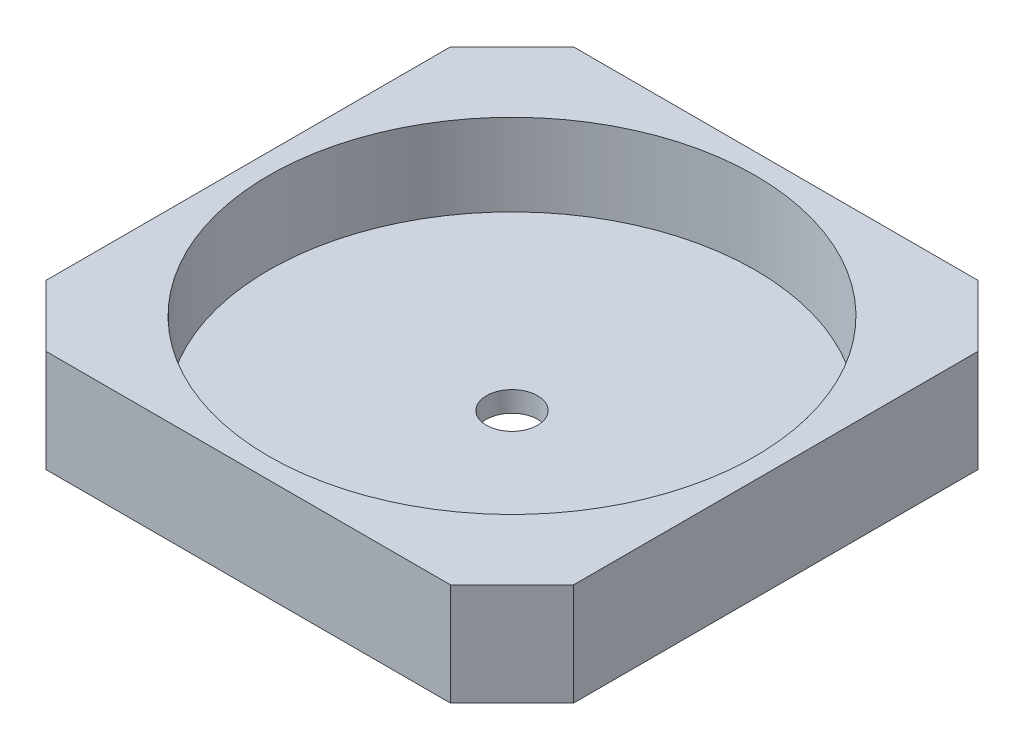
ISO-10303-21;
HEADER;
FILE_DESCRIPTION(('STEP AP214'),'2;1');
FILE_NAME('part.step','',(''),(''),'','','');
FILE_SCHEMA(('AUTOMOTIVE_DESIGN { 1 0 10303 214 1 1 1 1 }'));
ENDSEC;
DATA;
#1=APPLICATION_CONTEXT('core data for automotive mechanical design processes');
#2=APPLICATION_PROTOCOL_DEFINITION('international standard','automotive_design',2000,#1);
#3=PRODUCT_CONTEXT('',#1,'mechanical');
#4=PRODUCT('Part','Part','',(#3));
#5=PRODUCT_RELATED_PRODUCT_CATEGORY('part','',(#4));
#6=PRODUCT_DEFINITION_FORMATION('','',#4);
#7=PRODUCT_DEFINITION_CONTEXT('part definition',#1,'design');
#8=PRODUCT_DEFINITION('design','',#6,#7);
#9=PRODUCT_DEFINITION_SHAPE('','',#8);
#10=(LENGTH_UNIT() NAMED_UNIT(*) SI_UNIT(.MILLI.,.METRE.));
#11=(NAMED_UNIT(*) PLANE_ANGLE_UNIT() SI_UNIT($,.RADIAN.));
#12=(NAMED_UNIT(*) SI_UNIT($,.STERADIAN.) SOLID_ANGLE_UNIT());
#13=UNCERTAINTY_MEASURE_WITH_UNIT(LENGTH_MEASURE(1.E-05),#10,'distance_accuracy_value','');
#14=(GEOMETRIC_REPRESENTATION_CONTEXT(3) GLOBAL_UNCERTAINTY_ASSIGNED_CONTEXT((#13)) GLOBAL_UNIT_ASSIGNED_CONTEXT((#10,
#11,#12)) REPRESENTATION_CONTEXT('',''));
#15=CARTESIAN_POINT('',(0.,0.,0.));
#16=DIRECTION('',(0.,0.,1.));
#17=DIRECTION('',(1.,0.,0.));
#18=AXIS2_PLACEMENT_3D('',#15,#16,#17);
#19=CARTESIAN_POINT('',(0.,50.,0.));
#20=DIRECTION('',(0.,-1.,0.));
#21=DIRECTION('',(0.,0.,-1.));
#22=AXIS2_PLACEMENT_3D('',#19,#20,#21);
#23=CYLINDRICAL_SURFACE('',#22,118.75);
#24=CARTESIAN_POINT('',(0.,50.,0.));
#25=DIRECTION('',(0.,1.,0.));
#26=DIRECTION('',(0.,0.,1.));
#27=AXIS2_PLACEMENT_3D('',#24,#25,#26);
#28=CIRCLE('',#27,118.75);
#29=CARTESIAN_POINT('',(0.,50.,118.75));
#30=VERTEX_POINT('',#29);
#31=EDGE_CURVE('E187',#30,#30,#28,.T.);
#32=ORIENTED_EDGE('',*,*,#31,.T.);
#33=EDGE_LOOP('',(#32));
#34=FACE_BOUND('',#33,.T.);
#35=CARTESIAN_POINT('',(0.,10.,0.));
#36=DIRECTION('',(0.,-1.,0.));
#37=DIRECTION('',(0.,0.,-1.));
#38=AXIS2_PLACEMENT_3D('',#35,#36,#37);
#39=CIRCLE('',#38,118.75);
#40=CARTESIAN_POINT('',(0.,10.,-118.75));
#41=VERTEX_POINT('',#40);
#42=EDGE_CURVE('E192',#41,#41,#39,.T.);
#43=ORIENTED_EDGE('',*,*,#42,.T.);
#44=EDGE_LOOP('',(#43));
#45=FACE_BOUND('',#44,.T.);
#46=ADVANCED_FACE('F39',(#34,#45),#23,.F.);
#47=CARTESIAN_POINT('',(113.75,50.,-113.75));
#48=DIRECTION('',(0.707106781186547,0.,-0.707106781186548));
#49=DIRECTION('',(-0.707106781186548,0.,-0.707106781186547));
#50=AXIS2_PLACEMENT_3D('',#47,#48,#49);
#51=PLANE('',#50);
#52=DIRECTION('',(0.707106781186548,0.,0.707106781186547));
#53=VECTOR('',#52,1.);
#54=CARTESIAN_POINT('',(113.75,0.,-113.75));
#55=LINE('',#54,#53);
#56=CARTESIAN_POINT('',(98.75,0.,-128.75));
#57=VERTEX_POINT('',#56);
#58=CARTESIAN_POINT('',(128.75,0.,-98.75));
#59=VERTEX_POINT('',#58);
#60=EDGE_CURVE('E161',#57,#59,#55,.T.);
#61=ORIENTED_EDGE('',*,*,#60,.F.);
#62=DIRECTION('',(0.,-1.,0.));
#63=VECTOR('',#62,1.);
#64=CARTESIAN_POINT('',(98.75,50.,-128.75));
#65=LINE('',#64,#63);
#66=CARTESIAN_POINT('',(98.75,50.,-128.75));
#67=VERTEX_POINT('',#66);
#68=EDGE_CURVE('E11',#67,#57,#65,.T.);
#69=ORIENTED_EDGE('',*,*,#68,.F.);
#70=DIRECTION('',(0.707106781186548,0.,0.707106781186547));
#71=VECTOR('',#70,1.);
#72=CARTESIAN_POINT('',(113.75,50.,-113.75));
#73=LINE('',#72,#71);
#74=CARTESIAN_POINT('',(128.75,50.,-98.75));
#75=VERTEX_POINT('',#74);
#76=EDGE_CURVE('E208',#67,#75,#73,.T.);
#77=ORIENTED_EDGE('',*,*,#76,.T.);
#78=DIRECTION('',(0.,-1.,0.));
#79=VECTOR('',#78,1.);
#80=CARTESIAN_POINT('',(128.75,50.,-98.75));
#81=LINE('',#80,#79);
#82=EDGE_CURVE('E56',#75,#59,#81,.T.);
#83=ORIENTED_EDGE('',*,*,#82,.T.);
#84=EDGE_LOOP('',(#61,#69,#77,#83));
#85=FACE_BOUND('',#84,.T.);
#86=ADVANCED_FACE('F238',(#85),#51,.T.);
#87=CARTESIAN_POINT('',(0.,50.,-128.75));
#88=DIRECTION('',(0.,0.,-1.));
#89=DIRECTION('',(-1.,0.,0.));
#90=AXIS2_PLACEMENT_3D('',#87,#88,#89);
#91=PLANE('',#90);
#92=DIRECTION('',(1.,0.,0.));
#93=VECTOR('',#92,1.);
#94=CARTESIAN_POINT('',(0.,0.,-128.75));
#95=LINE('',#94,#93);
#96=CARTESIAN_POINT('',(-98.75,0.,-128.75));
#97=VERTEX_POINT('',#96);
#98=EDGE_CURVE('E157',#97,#57,#95,.T.);
#99=ORIENTED_EDGE('',*,*,#98,.F.);
#100=DIRECTION('',(0.,-1.,0.));
#101=VECTOR('',#100,1.);
#102=CARTESIAN_POINT('',(-98.75,50.,-128.75));
#103=LINE('',#102,#101);
#104=CARTESIAN_POINT('',(-98.75,50.,-128.75));
#105=VERTEX_POINT('',#104);
#106=EDGE_CURVE('E48',#105,#97,#103,.T.);
#107=ORIENTED_EDGE('',*,*,#106,.F.);
#108=DIRECTION('',(1.,0.,0.));
#109=VECTOR('',#108,1.);
#110=CARTESIAN_POINT('',(0.,50.,-128.75));
#111=LINE('',#110,#109);
#112=EDGE_CURVE('E211',#105,#67,#111,.T.);
#113=ORIENTED_EDGE('',*,*,#112,.T.);
#114=ORIENTED_EDGE('',*,*,#68,.T.);
#115=EDGE_LOOP('',(#99,#107,#113,#114));
#116=FACE_BOUND('',#115,.T.);
#117=ADVANCED_FACE('F158',(#116),#91,.T.);
#118=CARTESIAN_POINT('',(-113.75,50.,-113.75));
#119=DIRECTION('',(-0.707106781186548,0.,-0.707106781186547));
#120=DIRECTION('',(-0.707106781186547,0.,0.707106781186548));
#121=AXIS2_PLACEMENT_3D('',#118,#119,#120);
#122=PLANE('',#121);
#123=DIRECTION('',(0.707106781186547,0.,-0.707106781186548));
#124=VECTOR('',#123,1.);
#125=CARTESIAN_POINT('',(-113.75,0.,-113.75));
#126=LINE('',#125,#124);
#127=CARTESIAN_POINT('',(-128.75,0.,-98.75));
#128=VERTEX_POINT('',#127);
#129=EDGE_CURVE('E150',#128,#97,#126,.T.);
#130=ORIENTED_EDGE('',*,*,#129,.F.);
#131=DIRECTION('',(0.,-1.,0.));
#132=VECTOR('',#131,1.);
#133=CARTESIAN_POINT('',(-128.75,50.,-98.75));
#134=LINE('',#133,#132);
#135=CARTESIAN_POINT('',(-128.75,50.,-98.75));
#136=VERTEX_POINT('',#135);
#137=EDGE_CURVE('E141',#136,#128,#134,.T.);
#138=ORIENTED_EDGE('',*,*,#137,.F.);
#139=DIRECTION('',(0.707106781186547,0.,-0.707106781186548));
#140=VECTOR('',#139,1.);
#141=CARTESIAN_POINT('',(-113.75,50.,-113.75));
#142=LINE('',#141,#140);
#143=EDGE_CURVE('E152',#136,#105,#142,.T.);
#144=ORIENTED_EDGE('',*,*,#143,.T.);
#145=ORIENTED_EDGE('',*,*,#106,.T.);
#146=EDGE_LOOP('',(#130,#138,#144,#145));
#147=FACE_BOUND('',#146,.T.);
#148=ADVANCED_FACE('F148',(#147),#122,.T.);
#149=CARTESIAN_POINT('',(-128.75,50.,0.));
#150=DIRECTION('',(1.,0.,0.));
#151=DIRECTION('',(0.,0.,-1.));
#152=AXIS2_PLACEMENT_3D('',#149,#150,#151);
#153=PLANE('',#152);
#154=DIRECTION('',(0.,0.,1.));
#155=VECTOR('',#154,1.);
#156=CARTESIAN_POINT('',(-128.75,0.,0.));
#157=LINE('',#156,#155);
#158=CARTESIAN_POINT('',(-128.75,0.,98.75));
#159=VERTEX_POINT('',#158);
#160=EDGE_CURVE('E168',#128,#159,#157,.T.);
#161=ORIENTED_EDGE('',*,*,#160,.T.);
#162=DIRECTION('',(0.,-1.,0.));
#163=VECTOR('',#162,1.);
#164=CARTESIAN_POINT('',(-128.75,50.,98.75));
#165=LINE('',#164,#163);
#166=CARTESIAN_POINT('',(-128.75,50.,98.75));
#167=VERTEX_POINT('',#166);
#168=EDGE_CURVE('E134',#167,#159,#165,.T.);
#169=ORIENTED_EDGE('',*,*,#168,.F.);
#170=DIRECTION('',(0.,0.,1.));
#171=VECTOR('',#170,1.);
#172=CARTESIAN_POINT('',(-128.75,50.,0.));
#173=LINE('',#172,#171);
#174=EDGE_CURVE('E216',#136,#167,#173,.T.);
#175=ORIENTED_EDGE('',*,*,#174,.F.);
#176=ORIENTED_EDGE('',*,*,#137,.T.);
#177=EDGE_LOOP('',(#161,#169,#175,#176));
#178=FACE_BOUND('',#177,.T.);
#179=ADVANCED_FACE('F223',(#178),#153,.F.);
#180=CARTESIAN_POINT('',(-113.75,50.,113.75));
#181=DIRECTION('',(0.707106781186548,0.,-0.707106781186547));
#182=DIRECTION('',(-0.707106781186547,0.,-0.707106781186548));
#183=AXIS2_PLACEMENT_3D('',#180,#181,#182);
#184=PLANE('',#183);
#185=DIRECTION('',(0.707106781186547,0.,0.707106781186548));
#186=VECTOR('',#185,1.);
#187=CARTESIAN_POINT('',(-113.75,0.,113.75));
#188=LINE('',#187,#186);
#189=CARTESIAN_POINT('',(-98.75,0.,128.75));
#190=VERTEX_POINT('',#189);
#191=EDGE_CURVE('E172',#159,#190,#188,.T.);
#192=ORIENTED_EDGE('',*,*,#191,.T.);
#193=DIRECTION('',(0.,-1.,0.));
#194=VECTOR('',#193,1.);
#195=CARTESIAN_POINT('',(-98.75,50.,128.75));
#196=LINE('',#195,#194);
#197=CARTESIAN_POINT('',(-98.75,50.,128.75));
#198=VERTEX_POINT('',#197);
#199=EDGE_CURVE('E130',#198,#190,#196,.T.);
#200=ORIENTED_EDGE('',*,*,#199,.F.);
#201=DIRECTION('',(0.707106781186547,0.,0.707106781186548));
#202=VECTOR('',#201,1.);
#203=CARTESIAN_POINT('',(-113.75,50.,113.75));
#204=LINE('',#203,#202);
#205=EDGE_CURVE('E120',#167,#198,#204,.T.);
#206=ORIENTED_EDGE('',*,*,#205,.F.);
#207=ORIENTED_EDGE('',*,*,#168,.T.);
#208=EDGE_LOOP('',(#192,#200,#206,#207));
#209=FACE_BOUND('',#208,.T.);
#210=ADVANCED_FACE('F225',(#209),#184,.F.);
#211=CARTESIAN_POINT('',(0.,50.,128.75));
#212=DIRECTION('',(0.,0.,-1.));
#213=DIRECTION('',(-1.,0.,0.));
#214=AXIS2_PLACEMENT_3D('',#211,#212,#213);
#215=PLANE('',#214);
#216=DIRECTION('',(1.,0.,0.));
#217=VECTOR('',#216,1.);
#218=CARTESIAN_POINT('',(0.,0.,128.75));
#219=LINE('',#218,#217);
#220=CARTESIAN_POINT('',(98.75,0.,128.75));
#221=VERTEX_POINT('',#220);
#222=EDGE_CURVE('E128',#190,#221,#219,.T.);
#223=ORIENTED_EDGE('',*,*,#222,.T.);
#224=DIRECTION('',(0.,-1.,0.));
#225=VECTOR('',#224,1.);
#226=CARTESIAN_POINT('',(98.75,50.,128.75));
#227=LINE('',#226,#225);
#228=CARTESIAN_POINT('',(98.75,50.,128.75));
#229=VERTEX_POINT('',#228);
#230=EDGE_CURVE('E109',#229,#221,#227,.T.);
#231=ORIENTED_EDGE('',*,*,#230,.F.);
#232=DIRECTION('',(1.,0.,0.));
#233=VECTOR('',#232,1.);
#234=CARTESIAN_POINT('',(0.,50.,128.75));
#235=LINE('',#234,#233);
#236=EDGE_CURVE('E115',#198,#229,#235,.T.);
#237=ORIENTED_EDGE('',*,*,#236,.F.);
#238=ORIENTED_EDGE('',*,*,#199,.T.);
#239=EDGE_LOOP('',(#223,#231,#237,#238));
#240=FACE_BOUND('',#239,.T.);
#241=ADVANCED_FACE('F126',(#240),#215,.F.);
#242=CARTESIAN_POINT('',(113.75,50.,113.75));
#243=DIRECTION('',(-0.707106781186548,0.,-0.707106781186548));
#244=DIRECTION('',(-0.707106781186548,0.,0.707106781186548));
#245=AXIS2_PLACEMENT_3D('',#242,#243,#244);
#246=PLANE('',#245);
#247=DIRECTION('',(0.707106781186548,0.,-0.707106781186548));
#248=VECTOR('',#247,1.);
#249=CARTESIAN_POINT('',(113.75,0.,113.75));
#250=LINE('',#249,#248);
#251=CARTESIAN_POINT('',(128.75,0.,98.75));
#252=VERTEX_POINT('',#251);
#253=EDGE_CURVE('E181',#221,#252,#250,.T.);
#254=ORIENTED_EDGE('',*,*,#253,.T.);
#255=DIRECTION('',(0.,-1.,0.));
#256=VECTOR('',#255,1.);
#257=CARTESIAN_POINT('',(128.75,50.,98.75));
#258=LINE('',#257,#256);
#259=CARTESIAN_POINT('',(128.75,50.,98.75));
#260=VERTEX_POINT('',#259);
#261=EDGE_CURVE('E82',#260,#252,#258,.T.);
#262=ORIENTED_EDGE('',*,*,#261,.F.);
#263=DIRECTION('',(0.707106781186548,0.,-0.707106781186548));
#264=VECTOR('',#263,1.);
#265=CARTESIAN_POINT('',(113.75,50.,113.75));
#266=LINE('',#265,#264);
#267=EDGE_CURVE('E105',#229,#260,#266,.T.);
#268=ORIENTED_EDGE('',*,*,#267,.F.);
#269=ORIENTED_EDGE('',*,*,#230,.T.);
#270=EDGE_LOOP('',(#254,#262,#268,#269));
#271=FACE_BOUND('',#270,.T.);
#272=ADVANCED_FACE('F107',(#271),#246,.F.);
#273=CARTESIAN_POINT('',(128.75,50.,0.));
#274=DIRECTION('',(1.,0.,0.));
#275=DIRECTION('',(0.,0.,-1.));
#276=AXIS2_PLACEMENT_3D('',#273,#274,#275);
#277=PLANE('',#276);
#278=DIRECTION('',(0.,0.,1.));
#279=VECTOR('',#278,1.);
#280=CARTESIAN_POINT('',(128.75,0.,0.));
#281=LINE('',#280,#279);
#282=EDGE_CURVE('E184',#59,#252,#281,.T.);
#283=ORIENTED_EDGE('',*,*,#282,.F.);
#284=ORIENTED_EDGE('',*,*,#82,.F.);
#285=DIRECTION('',(0.,0.,1.));
#286=VECTOR('',#285,1.);
#287=CARTESIAN_POINT('',(128.75,50.,0.));
#288=LINE('',#287,#286);
#289=EDGE_CURVE('E114',#75,#260,#288,.T.);
#290=ORIENTED_EDGE('',*,*,#289,.T.);
#291=ORIENTED_EDGE('',*,*,#261,.T.);
#292=EDGE_LOOP('',(#283,#284,#290,#291));
#293=FACE_BOUND('',#292,.T.);
#294=ADVANCED_FACE('F226',(#293),#277,.T.);
#295=CARTESIAN_POINT('',(0.,50.,0.));
#296=DIRECTION('',(0.,1.,0.));
#297=DIRECTION('',(0.,0.,1.));
#298=AXIS2_PLACEMENT_3D('',#295,#296,#297);
#299=PLANE('',#298);
#300=ORIENTED_EDGE('',*,*,#31,.F.);
#301=EDGE_LOOP('',(#300));
#302=FACE_BOUND('',#301,.T.);
#303=ORIENTED_EDGE('',*,*,#76,.F.);
#304=ORIENTED_EDGE('',*,*,#112,.F.);
#305=ORIENTED_EDGE('',*,*,#143,.F.);
#306=ORIENTED_EDGE('',*,*,#174,.T.);
#307=ORIENTED_EDGE('',*,*,#205,.T.);
#308=ORIENTED_EDGE('',*,*,#236,.T.);
#309=ORIENTED_EDGE('',*,*,#267,.T.);
#310=ORIENTED_EDGE('',*,*,#289,.F.);
#311=EDGE_LOOP('',(#303,#304,#305,#306,#307,#308,#309,#310));
#312=FACE_BOUND('',#311,.T.);
#313=ADVANCED_FACE('F118',(#302,#312),#299,.T.);
#314=CARTESIAN_POINT('',(0.,0.,0.));
#315=DIRECTION('',(0.,1.,0.));
#316=DIRECTION('',(0.,0.,1.));
#317=AXIS2_PLACEMENT_3D('',#314,#315,#316);
#318=PLANE('',#317);
#319=ORIENTED_EDGE('',*,*,#60,.T.);
#320=ORIENTED_EDGE('',*,*,#282,.T.);
#321=ORIENTED_EDGE('',*,*,#253,.F.);
#322=ORIENTED_EDGE('',*,*,#222,.F.);
#323=ORIENTED_EDGE('',*,*,#191,.F.);
#324=ORIENTED_EDGE('',*,*,#160,.F.);
#325=ORIENTED_EDGE('',*,*,#129,.T.);
#326=ORIENTED_EDGE('',*,*,#98,.T.);
#327=EDGE_LOOP('',(#319,#320,#321,#322,#323,#324,#325,#326));
#328=FACE_BOUND('',#327,.T.);
#329=CARTESIAN_POINT('',(0.,0.,0.));
#330=DIRECTION('',(0.,-1.,0.));
#331=DIRECTION('',(0.,0.,-1.));
#332=AXIS2_PLACEMENT_3D('',#329,#330,#331);
#333=CIRCLE('',#332,12.5);
#334=CARTESIAN_POINT('',(0.,0.,-12.5));
#335=VERTEX_POINT('',#334);
#336=EDGE_CURVE('E201',#335,#335,#333,.T.);
#337=ORIENTED_EDGE('',*,*,#336,.F.);
#338=EDGE_LOOP('',(#337));
#339=FACE_BOUND('',#338,.T.);
#340=ADVANCED_FACE('F164',(#328,#339),#318,.F.);
#341=CARTESIAN_POINT('',(0.,10.,0.));
#342=DIRECTION('',(0.,-1.,0.));
#343=DIRECTION('',(0.,0.,-1.));
#344=AXIS2_PLACEMENT_3D('',#341,#342,#343);
#345=PLANE('',#344);
#346=ORIENTED_EDGE('',*,*,#42,.F.);
#347=EDGE_LOOP('',(#346));
#348=FACE_BOUND('',#347,.T.);
#349=CARTESIAN_POINT('',(0.,10.,0.));
#350=DIRECTION('',(0.,-1.,0.));
#351=DIRECTION('',(0.,0.,-1.));
#352=AXIS2_PLACEMENT_3D('',#349,#350,#351);
#353=CIRCLE('',#352,12.5);
#354=CARTESIAN_POINT('',(0.,10.,-12.5));
#355=VERTEX_POINT('',#354);
#356=EDGE_CURVE('E195',#355,#355,#353,.T.);
#357=ORIENTED_EDGE('',*,*,#356,.T.);
#358=EDGE_LOOP('',(#357));
#359=FACE_BOUND('',#358,.T.);
#360=ADVANCED_FACE('F278',(#348,#359),#345,.F.);
#361=CARTESIAN_POINT('',(0.,10.,0.));
#362=DIRECTION('',(0.,-1.,0.));
#363=DIRECTION('',(0.,0.,-1.));
#364=AXIS2_PLACEMENT_3D('',#361,#362,#363);
#365=CYLINDRICAL_SURFACE('',#364,12.5);
#366=ORIENTED_EDGE('',*,*,#356,.F.);
#367=EDGE_LOOP('',(#366));
#368=FACE_BOUND('',#367,.T.);
#369=ORIENTED_EDGE('',*,*,#336,.T.);
#370=EDGE_LOOP('',(#369));
#371=FACE_BOUND('',#370,.T.);
#372=ADVANCED_FACE('F288',(#368,#371),#365,.F.);
#373=CLOSED_SHELL('',(#46,#86,#117,#148,#179,#210,#241,#272,#294,#313,#340,#360,#372));
#374=MANIFOLD_SOLID_BREP('B2',#373);
#375=ADVANCED_BREP_SHAPE_REPRESENTATION('',(#18,#374),#14);
#376=SHAPE_DEFINITION_REPRESENTATION(#9,#375);
ENDSEC;
END-ISO-10303-21;
